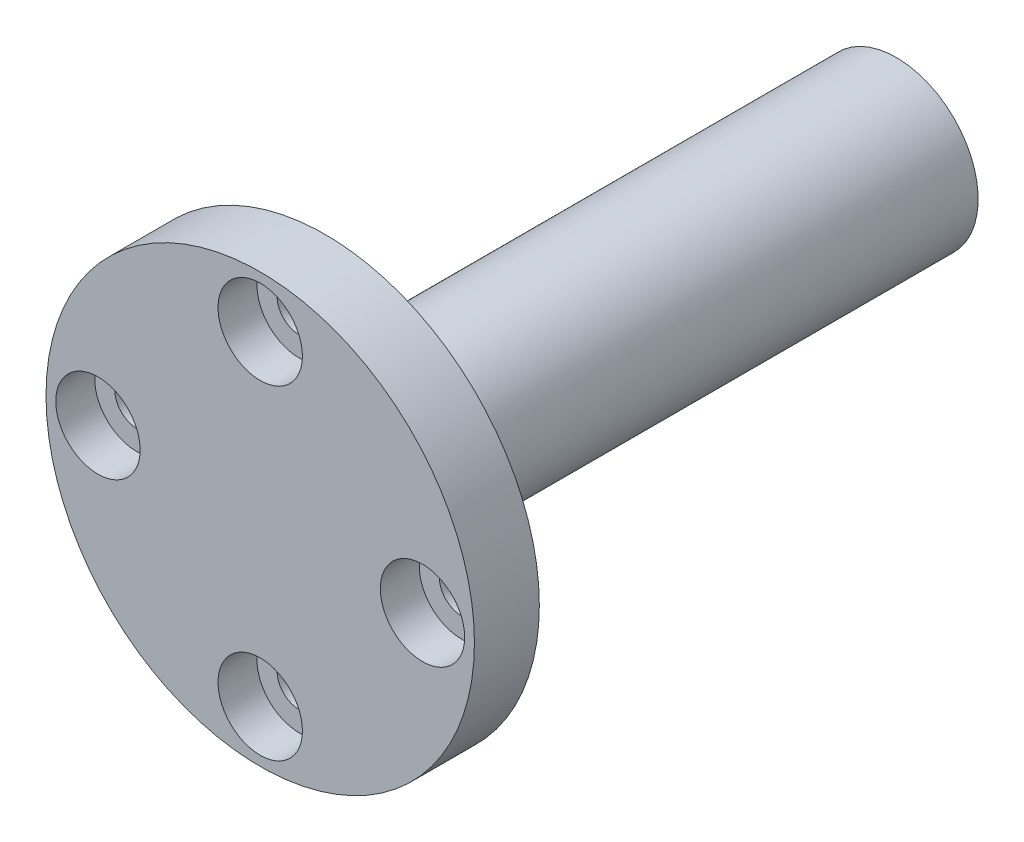
ISO-10303-21;
HEADER;
FILE_DESCRIPTION(('STEP AP214'),'2;1');
FILE_NAME('part.step','',(''),(''),'','','');
FILE_SCHEMA(('AUTOMOTIVE_DESIGN { 1 0 10303 214 1 1 1 1 }'));
ENDSEC;
DATA;
#1=APPLICATION_CONTEXT('core data for automotive mechanical design processes');
#2=APPLICATION_PROTOCOL_DEFINITION('international standard','automotive_design',2000,#1);
#3=PRODUCT_CONTEXT('',#1,'mechanical');
#4=PRODUCT('Part','Part','',(#3));
#5=PRODUCT_RELATED_PRODUCT_CATEGORY('part','',(#4));
#6=PRODUCT_DEFINITION_FORMATION('','',#4);
#7=PRODUCT_DEFINITION_CONTEXT('part definition',#1,'design');
#8=PRODUCT_DEFINITION('design','',#6,#7);
#9=PRODUCT_DEFINITION_SHAPE('','',#8);
#10=(LENGTH_UNIT() NAMED_UNIT(*) SI_UNIT(.MILLI.,.METRE.));
#11=(NAMED_UNIT(*) PLANE_ANGLE_UNIT() SI_UNIT($,.RADIAN.));
#12=(NAMED_UNIT(*) SI_UNIT($,.STERADIAN.) SOLID_ANGLE_UNIT());
#13=UNCERTAINTY_MEASURE_WITH_UNIT(LENGTH_MEASURE(1.E-05),#10,'distance_accuracy_value','');
#14=(GEOMETRIC_REPRESENTATION_CONTEXT(3) GLOBAL_UNCERTAINTY_ASSIGNED_CONTEXT((#13)) GLOBAL_UNIT_ASSIGNED_CONTEXT((#10,
#11,#12)) REPRESENTATION_CONTEXT('',''));
#15=CARTESIAN_POINT('',(0.,0.,0.));
#16=DIRECTION('',(0.,0.,1.));
#17=DIRECTION('',(1.,0.,0.));
#18=AXIS2_PLACEMENT_3D('',#15,#16,#17);
#19=CARTESIAN_POINT('',(0.,0.,0.));
#20=DIRECTION('',(0.,0.,1.));
#21=DIRECTION('',(1.,0.,0.));
#22=AXIS2_PLACEMENT_3D('',#19,#20,#21);
#23=PLANE('',#22);
#24=CARTESIAN_POINT('',(-12.4999999999996,-3.52209826717166E-13,0.));
#25=DIRECTION('',(0.,0.,1.));
#26=DIRECTION('',(1.,0.,0.));
#27=AXIS2_PLACEMENT_3D('',#24,#25,#26);
#28=CIRCLE('',#27,3.25);
#29=CARTESIAN_POINT('',(-9.24999999999965,-3.52209826717166E-13,0.));
#30=VERTEX_POINT('',#29);
#31=EDGE_CURVE('E61',#30,#30,#28,.T.);
#32=ORIENTED_EDGE('',*,*,#31,.F.);
#33=EDGE_LOOP('',(#32));
#34=FACE_BOUND('',#33,.T.);
#35=CARTESIAN_POINT('',(0.,12.5,0.));
#36=DIRECTION('',(0.,0.,1.));
#37=DIRECTION('',(1.,0.,0.));
#38=AXIS2_PLACEMENT_3D('',#35,#36,#37);
#39=CIRCLE('',#38,3.25);
#40=CARTESIAN_POINT('',(3.25,12.5,0.));
#41=VERTEX_POINT('',#40);
#42=EDGE_CURVE('E75',#41,#41,#39,.T.);
#43=ORIENTED_EDGE('',*,*,#42,.F.);
#44=EDGE_LOOP('',(#43));
#45=FACE_BOUND('',#44,.T.);
#46=CARTESIAN_POINT('',(12.5000000000004,3.537406352161E-13,0.));
#47=DIRECTION('',(0.,0.,1.));
#48=DIRECTION('',(1.,0.,0.));
#49=AXIS2_PLACEMENT_3D('',#46,#47,#48);
#50=CIRCLE('',#49,3.25);
#51=CARTESIAN_POINT('',(15.7500000000004,3.537406352161E-13,0.));
#52=VERTEX_POINT('',#51);
#53=EDGE_CURVE('E85',#52,#52,#50,.T.);
#54=ORIENTED_EDGE('',*,*,#53,.F.);
#55=EDGE_LOOP('',(#54));
#56=FACE_BOUND('',#55,.T.);
#57=CARTESIAN_POINT('',(7.074812704322E-13,-12.5,0.));
#58=DIRECTION('',(0.,0.,1.));
#59=DIRECTION('',(1.,0.,0.));
#60=AXIS2_PLACEMENT_3D('',#57,#58,#59);
#61=CIRCLE('',#60,3.25);
#62=CARTESIAN_POINT('',(3.25000000000071,-12.5,0.));
#63=VERTEX_POINT('',#62);
#64=EDGE_CURVE('E95',#63,#63,#61,.T.);
#65=ORIENTED_EDGE('',*,*,#64,.F.);
#66=EDGE_LOOP('',(#65));
#67=FACE_BOUND('',#66,.T.);
#68=CARTESIAN_POINT('',(0.,0.,0.));
#69=DIRECTION('',(0.,0.,-1.));
#70=DIRECTION('',(-1.,0.,0.));
#71=AXIS2_PLACEMENT_3D('',#68,#69,#70);
#72=CIRCLE('',#71,16.5);
#73=CARTESIAN_POINT('',(-16.5,0.,0.));
#74=VERTEX_POINT('',#73);
#75=EDGE_CURVE('E11',#74,#74,#72,.T.);
#76=ORIENTED_EDGE('',*,*,#75,.F.);
#77=EDGE_LOOP('',(#76));
#78=FACE_BOUND('',#77,.T.);
#79=ADVANCED_FACE('F40',(#34,#45,#56,#67,#78),#23,.T.);
#80=CARTESIAN_POINT('',(0.,0.,-49.));
#81=DIRECTION('',(0.,0.,-1.));
#82=DIRECTION('',(-1.,0.,0.));
#83=AXIS2_PLACEMENT_3D('',#80,#81,#82);
#84=CYLINDRICAL_SURFACE('',#83,16.5);
#85=ORIENTED_EDGE('',*,*,#75,.T.);
#86=EDGE_LOOP('',(#85));
#87=FACE_BOUND('',#86,.T.);
#88=CARTESIAN_POINT('',(0.,0.,-5.));
#89=DIRECTION('',(0.,0.,-1.));
#90=DIRECTION('',(-1.,0.,0.));
#91=AXIS2_PLACEMENT_3D('',#88,#89,#90);
#92=CIRCLE('',#91,16.5);
#93=CARTESIAN_POINT('',(-16.5,0.,-5.));
#94=VERTEX_POINT('',#93);
#95=EDGE_CURVE('E47',#94,#94,#92,.T.);
#96=ORIENTED_EDGE('',*,*,#95,.F.);
#97=EDGE_LOOP('',(#96));
#98=FACE_BOUND('',#97,.T.);
#99=ADVANCED_FACE('F126',(#87,#98),#84,.T.);
#100=CARTESIAN_POINT('',(0.,16.5,-5.));
#101=DIRECTION('',(0.,0.,-1.));
#102=DIRECTION('',(-1.,0.,0.));
#103=AXIS2_PLACEMENT_3D('',#100,#101,#102);
#104=PLANE('',#103);
#105=CARTESIAN_POINT('',(-12.4999999999996,-3.52209826717166E-13,-5.));
#106=DIRECTION('',(0.,0.,-1.));
#107=DIRECTION('',(-1.,0.,0.));
#108=AXIS2_PLACEMENT_3D('',#105,#106,#107);
#109=CIRCLE('',#108,1.69999999999999);
#110=CARTESIAN_POINT('',(-14.1999999999996,-3.52209826717166E-13,-5.));
#111=VERTEX_POINT('',#110);
#112=EDGE_CURVE('E43',#111,#111,#109,.T.);
#113=ORIENTED_EDGE('',*,*,#112,.F.);
#114=EDGE_LOOP('',(#113));
#115=FACE_BOUND('',#114,.T.);
#116=CARTESIAN_POINT('',(0.,12.5,-5.));
#117=DIRECTION('',(0.,0.,-1.));
#118=DIRECTION('',(-1.,0.,0.));
#119=AXIS2_PLACEMENT_3D('',#116,#117,#118);
#120=CIRCLE('',#119,1.69999999999999);
#121=CARTESIAN_POINT('',(-1.69999999999999,12.5,-5.));
#122=VERTEX_POINT('',#121);
#123=EDGE_CURVE('E84',#122,#122,#120,.T.);
#124=ORIENTED_EDGE('',*,*,#123,.F.);
#125=EDGE_LOOP('',(#124));
#126=FACE_BOUND('',#125,.T.);
#127=CARTESIAN_POINT('',(12.5000000000004,3.537406352161E-13,-5.));
#128=DIRECTION('',(0.,0.,-1.));
#129=DIRECTION('',(-1.,0.,0.));
#130=AXIS2_PLACEMENT_3D('',#127,#128,#129);
#131=CIRCLE('',#130,1.69999999999999);
#132=CARTESIAN_POINT('',(10.8000000000004,3.537406352161E-13,-5.));
#133=VERTEX_POINT('',#132);
#134=EDGE_CURVE('E94',#133,#133,#131,.T.);
#135=ORIENTED_EDGE('',*,*,#134,.F.);
#136=EDGE_LOOP('',(#135));
#137=FACE_BOUND('',#136,.T.);
#138=CARTESIAN_POINT('',(7.074812704322E-13,-12.5,-5.));
#139=DIRECTION('',(0.,0.,-1.));
#140=DIRECTION('',(-1.,0.,0.));
#141=AXIS2_PLACEMENT_3D('',#138,#139,#140);
#142=CIRCLE('',#141,1.69999999999999);
#143=CARTESIAN_POINT('',(-1.69999999999929,-12.5,-5.));
#144=VERTEX_POINT('',#143);
#145=EDGE_CURVE('E104',#144,#144,#142,.T.);
#146=ORIENTED_EDGE('',*,*,#145,.F.);
#147=EDGE_LOOP('',(#146));
#148=FACE_BOUND('',#147,.T.);
#149=ORIENTED_EDGE('',*,*,#95,.T.);
#150=EDGE_LOOP('',(#149));
#151=FACE_BOUND('',#150,.T.);
#152=CARTESIAN_POINT('',(0.,0.,-5.));
#153=DIRECTION('',(0.,0.,-1.));
#154=DIRECTION('',(-1.,0.,0.));
#155=AXIS2_PLACEMENT_3D('',#152,#153,#154);
#156=CIRCLE('',#155,6.3);
#157=CARTESIAN_POINT('',(-6.3,0.,-5.));
#158=VERTEX_POINT('',#157);
#159=EDGE_CURVE('E108',#158,#158,#156,.T.);
#160=ORIENTED_EDGE('',*,*,#159,.F.);
#161=EDGE_LOOP('',(#160));
#162=FACE_BOUND('',#161,.T.);
#163=ADVANCED_FACE('F122',(#115,#126,#137,#148,#151,#162),#104,.T.);
#164=CARTESIAN_POINT('',(0.,0.,-49.));
#165=DIRECTION('',(0.,0.,-1.));
#166=DIRECTION('',(-1.,0.,0.));
#167=AXIS2_PLACEMENT_3D('',#164,#165,#166);
#168=CYLINDRICAL_SURFACE('',#167,6.3);
#169=ORIENTED_EDGE('',*,*,#159,.T.);
#170=EDGE_LOOP('',(#169));
#171=FACE_BOUND('',#170,.T.);
#172=CARTESIAN_POINT('',(0.,0.,-49.));
#173=DIRECTION('',(0.,0.,-1.));
#174=DIRECTION('',(-1.,0.,0.));
#175=AXIS2_PLACEMENT_3D('',#172,#173,#174);
#176=CIRCLE('',#175,6.3);
#177=CARTESIAN_POINT('',(-6.3,0.,-49.));
#178=VERTEX_POINT('',#177);
#179=EDGE_CURVE('E105',#178,#178,#176,.T.);
#180=ORIENTED_EDGE('',*,*,#179,.F.);
#181=EDGE_LOOP('',(#180));
#182=FACE_BOUND('',#181,.T.);
#183=ADVANCED_FACE('F125',(#171,#182),#168,.T.);
#184=CARTESIAN_POINT('',(0.,6.3,-49.));
#185=DIRECTION('',(0.,0.,-1.));
#186=DIRECTION('',(-1.,0.,0.));
#187=AXIS2_PLACEMENT_3D('',#184,#185,#186);
#188=PLANE('',#187);
#189=CARTESIAN_POINT('',(0.,0.,-49.));
#190=DIRECTION('',(0.,0.,-1.));
#191=DIRECTION('',(-1.,0.,0.));
#192=AXIS2_PLACEMENT_3D('',#189,#190,#191);
#193=CIRCLE('',#192,1.25);
#194=CARTESIAN_POINT('',(-1.25,0.,-49.));
#195=VERTEX_POINT('',#194);
#196=EDGE_CURVE('E62',#195,#195,#193,.T.);
#197=ORIENTED_EDGE('',*,*,#196,.F.);
#198=EDGE_LOOP('',(#197));
#199=FACE_BOUND('',#198,.T.);
#200=ORIENTED_EDGE('',*,*,#179,.T.);
#201=EDGE_LOOP('',(#200));
#202=FACE_BOUND('',#201,.T.);
#203=ADVANCED_FACE('F139',(#199,#202),#188,.T.);
#204=CARTESIAN_POINT('',(7.074812704322E-13,-12.5,0.));
#205=DIRECTION('',(0.,0.,1.));
#206=DIRECTION('',(1.,0.,0.));
#207=AXIS2_PLACEMENT_3D('',#204,#205,#206);
#208=CYLINDRICAL_SURFACE('',#207,1.69999999999999);
#209=ORIENTED_EDGE('',*,*,#145,.T.);
#210=EDGE_LOOP('',(#209));
#211=FACE_BOUND('',#210,.T.);
#212=CARTESIAN_POINT('',(7.074812704322E-13,-12.5,-3.));
#213=DIRECTION('',(0.,0.,1.));
#214=DIRECTION('',(1.,0.,0.));
#215=AXIS2_PLACEMENT_3D('',#212,#213,#214);
#216=CIRCLE('',#215,1.7);
#217=CARTESIAN_POINT('',(1.70000000000071,-12.5,-3.));
#218=VERTEX_POINT('',#217);
#219=EDGE_CURVE('E101',#218,#218,#216,.T.);
#220=ORIENTED_EDGE('',*,*,#219,.T.);
#221=EDGE_LOOP('',(#220));
#222=FACE_BOUND('',#221,.T.);
#223=ADVANCED_FACE('F144',(#211,#222),#208,.F.);
#224=CARTESIAN_POINT('',(1.70000000000071,-12.5,-3.));
#225=DIRECTION('',(0.,0.,-1.));
#226=DIRECTION('',(-1.,0.,0.));
#227=AXIS2_PLACEMENT_3D('',#224,#225,#226);
#228=PLANE('',#227);
#229=ORIENTED_EDGE('',*,*,#219,.F.);
#230=EDGE_LOOP('',(#229));
#231=FACE_BOUND('',#230,.T.);
#232=CARTESIAN_POINT('',(7.074812704322E-13,-12.5,-3.));
#233=DIRECTION('',(0.,0.,1.));
#234=DIRECTION('',(1.,0.,0.));
#235=AXIS2_PLACEMENT_3D('',#232,#233,#234);
#236=CIRCLE('',#235,3.25);
#237=CARTESIAN_POINT('',(3.25000000000071,-12.5,-3.));
#238=VERTEX_POINT('',#237);
#239=EDGE_CURVE('E98',#238,#238,#236,.T.);
#240=ORIENTED_EDGE('',*,*,#239,.T.);
#241=EDGE_LOOP('',(#240));
#242=FACE_BOUND('',#241,.T.);
#243=ADVANCED_FACE('F152',(#231,#242),#228,.F.);
#244=CARTESIAN_POINT('',(7.074812704322E-13,-12.5,0.));
#245=DIRECTION('',(0.,0.,1.));
#246=DIRECTION('',(1.,0.,0.));
#247=AXIS2_PLACEMENT_3D('',#244,#245,#246);
#248=CYLINDRICAL_SURFACE('',#247,3.25);
#249=ORIENTED_EDGE('',*,*,#239,.F.);
#250=EDGE_LOOP('',(#249));
#251=FACE_BOUND('',#250,.T.);
#252=ORIENTED_EDGE('',*,*,#64,.T.);
#253=EDGE_LOOP('',(#252));
#254=FACE_BOUND('',#253,.T.);
#255=ADVANCED_FACE('F173',(#251,#254),#248,.F.);
#256=CARTESIAN_POINT('',(12.5000000000004,3.537406352161E-13,0.));
#257=DIRECTION('',(0.,0.,1.));
#258=DIRECTION('',(1.,0.,0.));
#259=AXIS2_PLACEMENT_3D('',#256,#257,#258);
#260=CYLINDRICAL_SURFACE('',#259,1.69999999999999);
#261=ORIENTED_EDGE('',*,*,#134,.T.);
#262=EDGE_LOOP('',(#261));
#263=FACE_BOUND('',#262,.T.);
#264=CARTESIAN_POINT('',(12.5000000000004,3.537406352161E-13,-3.));
#265=DIRECTION('',(0.,0.,1.));
#266=DIRECTION('',(1.,0.,0.));
#267=AXIS2_PLACEMENT_3D('',#264,#265,#266);
#268=CIRCLE('',#267,1.7);
#269=CARTESIAN_POINT('',(14.2000000000004,3.537406352161E-13,-3.));
#270=VERTEX_POINT('',#269);
#271=EDGE_CURVE('E91',#270,#270,#268,.T.);
#272=ORIENTED_EDGE('',*,*,#271,.T.);
#273=EDGE_LOOP('',(#272));
#274=FACE_BOUND('',#273,.T.);
#275=ADVANCED_FACE('F175',(#263,#274),#260,.F.);
#276=CARTESIAN_POINT('',(14.2000000000004,3.537406352161E-13,-3.));
#277=DIRECTION('',(0.,0.,-1.));
#278=DIRECTION('',(-1.,0.,0.));
#279=AXIS2_PLACEMENT_3D('',#276,#277,#278);
#280=PLANE('',#279);
#281=ORIENTED_EDGE('',*,*,#271,.F.);
#282=EDGE_LOOP('',(#281));
#283=FACE_BOUND('',#282,.T.);
#284=CARTESIAN_POINT('',(12.5000000000004,3.537406352161E-13,-3.));
#285=DIRECTION('',(0.,0.,1.));
#286=DIRECTION('',(1.,0.,0.));
#287=AXIS2_PLACEMENT_3D('',#284,#285,#286);
#288=CIRCLE('',#287,3.25);
#289=CARTESIAN_POINT('',(15.7500000000004,3.537406352161E-13,-3.));
#290=VERTEX_POINT('',#289);
#291=EDGE_CURVE('E88',#290,#290,#288,.T.);
#292=ORIENTED_EDGE('',*,*,#291,.T.);
#293=EDGE_LOOP('',(#292));
#294=FACE_BOUND('',#293,.T.);
#295=ADVANCED_FACE('F182',(#283,#294),#280,.F.);
#296=CARTESIAN_POINT('',(12.5000000000004,3.537406352161E-13,0.));
#297=DIRECTION('',(0.,0.,1.));
#298=DIRECTION('',(1.,0.,0.));
#299=AXIS2_PLACEMENT_3D('',#296,#297,#298);
#300=CYLINDRICAL_SURFACE('',#299,3.25);
#301=ORIENTED_EDGE('',*,*,#291,.F.);
#302=EDGE_LOOP('',(#301));
#303=FACE_BOUND('',#302,.T.);
#304=ORIENTED_EDGE('',*,*,#53,.T.);
#305=EDGE_LOOP('',(#304));
#306=FACE_BOUND('',#305,.T.);
#307=ADVANCED_FACE('F191',(#303,#306),#300,.F.);
#308=CARTESIAN_POINT('',(0.,12.5,0.));
#309=DIRECTION('',(0.,0.,1.));
#310=DIRECTION('',(1.,0.,0.));
#311=AXIS2_PLACEMENT_3D('',#308,#309,#310);
#312=CYLINDRICAL_SURFACE('',#311,1.69999999999999);
#313=ORIENTED_EDGE('',*,*,#123,.T.);
#314=EDGE_LOOP('',(#313));
#315=FACE_BOUND('',#314,.T.);
#316=CARTESIAN_POINT('',(0.,12.5,-3.));
#317=DIRECTION('',(0.,0.,1.));
#318=DIRECTION('',(1.,0.,0.));
#319=AXIS2_PLACEMENT_3D('',#316,#317,#318);
#320=CIRCLE('',#319,1.7);
#321=CARTESIAN_POINT('',(1.7,12.5,-3.));
#322=VERTEX_POINT('',#321);
#323=EDGE_CURVE('E81',#322,#322,#320,.T.);
#324=ORIENTED_EDGE('',*,*,#323,.T.);
#325=EDGE_LOOP('',(#324));
#326=FACE_BOUND('',#325,.T.);
#327=ADVANCED_FACE('F119',(#315,#326),#312,.F.);
#328=CARTESIAN_POINT('',(1.7,12.5,-3.));
#329=DIRECTION('',(0.,0.,-1.));
#330=DIRECTION('',(-1.,0.,0.));
#331=AXIS2_PLACEMENT_3D('',#328,#329,#330);
#332=PLANE('',#331);
#333=ORIENTED_EDGE('',*,*,#323,.F.);
#334=EDGE_LOOP('',(#333));
#335=FACE_BOUND('',#334,.T.);
#336=CARTESIAN_POINT('',(0.,12.5,-3.));
#337=DIRECTION('',(0.,0.,1.));
#338=DIRECTION('',(1.,0.,0.));
#339=AXIS2_PLACEMENT_3D('',#336,#337,#338);
#340=CIRCLE('',#339,3.25);
#341=CARTESIAN_POINT('',(3.25,12.5,-3.));
#342=VERTEX_POINT('',#341);
#343=EDGE_CURVE('E78',#342,#342,#340,.T.);
#344=ORIENTED_EDGE('',*,*,#343,.T.);
#345=EDGE_LOOP('',(#344));
#346=FACE_BOUND('',#345,.T.);
#347=ADVANCED_FACE('F198',(#335,#346),#332,.F.);
#348=CARTESIAN_POINT('',(0.,12.5,0.));
#349=DIRECTION('',(0.,0.,1.));
#350=DIRECTION('',(1.,0.,0.));
#351=AXIS2_PLACEMENT_3D('',#348,#349,#350);
#352=CYLINDRICAL_SURFACE('',#351,3.25);
#353=ORIENTED_EDGE('',*,*,#343,.F.);
#354=EDGE_LOOP('',(#353));
#355=FACE_BOUND('',#354,.T.);
#356=ORIENTED_EDGE('',*,*,#42,.T.);
#357=EDGE_LOOP('',(#356));
#358=FACE_BOUND('',#357,.T.);
#359=ADVANCED_FACE('F201',(#355,#358),#352,.F.);
#360=CARTESIAN_POINT('',(-12.4999999999996,-3.52209826717166E-13,0.));
#361=DIRECTION('',(0.,0.,1.));
#362=DIRECTION('',(1.,0.,0.));
#363=AXIS2_PLACEMENT_3D('',#360,#361,#362);
#364=CYLINDRICAL_SURFACE('',#363,1.69999999999999);
#365=ORIENTED_EDGE('',*,*,#112,.T.);
#366=EDGE_LOOP('',(#365));
#367=FACE_BOUND('',#366,.T.);
#368=CARTESIAN_POINT('',(-12.4999999999996,-3.52209826717166E-13,-3.));
#369=DIRECTION('',(0.,0.,1.));
#370=DIRECTION('',(1.,0.,0.));
#371=AXIS2_PLACEMENT_3D('',#368,#369,#370);
#372=CIRCLE('',#371,1.7);
#373=CARTESIAN_POINT('',(-10.7999999999996,-3.52209826717166E-13,-3.));
#374=VERTEX_POINT('',#373);
#375=EDGE_CURVE('E72',#374,#374,#372,.T.);
#376=ORIENTED_EDGE('',*,*,#375,.T.);
#377=EDGE_LOOP('',(#376));
#378=FACE_BOUND('',#377,.T.);
#379=ADVANCED_FACE('F205',(#367,#378),#364,.F.);
#380=CARTESIAN_POINT('',(-10.7999999999996,-3.52209826717166E-13,-3.));
#381=DIRECTION('',(0.,0.,-1.));
#382=DIRECTION('',(-1.,0.,0.));
#383=AXIS2_PLACEMENT_3D('',#380,#381,#382);
#384=PLANE('',#383);
#385=ORIENTED_EDGE('',*,*,#375,.F.);
#386=EDGE_LOOP('',(#385));
#387=FACE_BOUND('',#386,.T.);
#388=CARTESIAN_POINT('',(-12.4999999999996,-3.52209826717166E-13,-3.));
#389=DIRECTION('',(0.,0.,1.));
#390=DIRECTION('',(1.,0.,0.));
#391=AXIS2_PLACEMENT_3D('',#388,#389,#390);
#392=CIRCLE('',#391,3.25);
#393=CARTESIAN_POINT('',(-9.24999999999965,-3.52209826717166E-13,-3.));
#394=VERTEX_POINT('',#393);
#395=EDGE_CURVE('E65',#394,#394,#392,.T.);
#396=ORIENTED_EDGE('',*,*,#395,.T.);
#397=EDGE_LOOP('',(#396));
#398=FACE_BOUND('',#397,.T.);
#399=ADVANCED_FACE('F209',(#387,#398),#384,.F.);
#400=CARTESIAN_POINT('',(-12.4999999999996,-3.52209826717166E-13,0.));
#401=DIRECTION('',(0.,0.,1.));
#402=DIRECTION('',(1.,0.,0.));
#403=AXIS2_PLACEMENT_3D('',#400,#401,#402);
#404=CYLINDRICAL_SURFACE('',#403,3.25);
#405=ORIENTED_EDGE('',*,*,#395,.F.);
#406=EDGE_LOOP('',(#405));
#407=FACE_BOUND('',#406,.T.);
#408=ORIENTED_EDGE('',*,*,#31,.T.);
#409=EDGE_LOOP('',(#408));
#410=FACE_BOUND('',#409,.T.);
#411=ADVANCED_FACE('F55',(#407,#410),#404,.F.);
#412=CARTESIAN_POINT('',(0.,0.,-34.));
#413=DIRECTION('',(0.,0.,-1.));
#414=DIRECTION('',(-1.,0.,0.));
#415=AXIS2_PLACEMENT_3D('',#412,#413,#414);
#416=CONICAL_SURFACE('',#415,1.25,1.02974425867665);
#417=CARTESIAN_POINT('',(0.,0.,-33.2489242262155));
#418=VERTEX_POINT('',#417);
#419=VERTEX_LOOP('',#418);
#420=FACE_BOUND('',#419,.T.);
#421=CARTESIAN_POINT('',(0.,0.,-34.));
#422=DIRECTION('',(0.,0.,-1.));
#423=DIRECTION('',(-1.,0.,0.));
#424=AXIS2_PLACEMENT_3D('',#421,#422,#423);
#425=CIRCLE('',#424,1.25);
#426=CARTESIAN_POINT('',(-1.25,0.,-34.));
#427=VERTEX_POINT('',#426);
#428=EDGE_CURVE('E59',#427,#427,#425,.T.);
#429=ORIENTED_EDGE('',*,*,#428,.T.);
#430=EDGE_LOOP('',(#429));
#431=FACE_BOUND('',#430,.T.);
#432=ADVANCED_FACE('F51',(#420,#431),#416,.F.);
#433=CARTESIAN_POINT('',(0.,0.,-49.));
#434=DIRECTION('',(0.,0.,-1.));
#435=DIRECTION('',(-1.,0.,0.));
#436=AXIS2_PLACEMENT_3D('',#433,#434,#435);
#437=CYLINDRICAL_SURFACE('',#436,1.25);
#438=ORIENTED_EDGE('',*,*,#428,.F.);
#439=EDGE_LOOP('',(#438));
#440=FACE_BOUND('',#439,.T.);
#441=ORIENTED_EDGE('',*,*,#196,.T.);
#442=EDGE_LOOP('',(#441));
#443=FACE_BOUND('',#442,.T.);
#444=ADVANCED_FACE('F54',(#440,#443),#437,.F.);
#445=CLOSED_SHELL('',(#79,#99,#163,#183,#203,#223,#243,#255,#275,#295,#307,#327,#347,#359,#379,
#399,#411,#432,#444));
#446=MANIFOLD_SOLID_BREP('B2',#445);
#447=ADVANCED_BREP_SHAPE_REPRESENTATION('',(#18,#446),#14);
#448=SHAPE_DEFINITION_REPRESENTATION(#9,#447);
ENDSEC;
END-ISO-10303-21;
